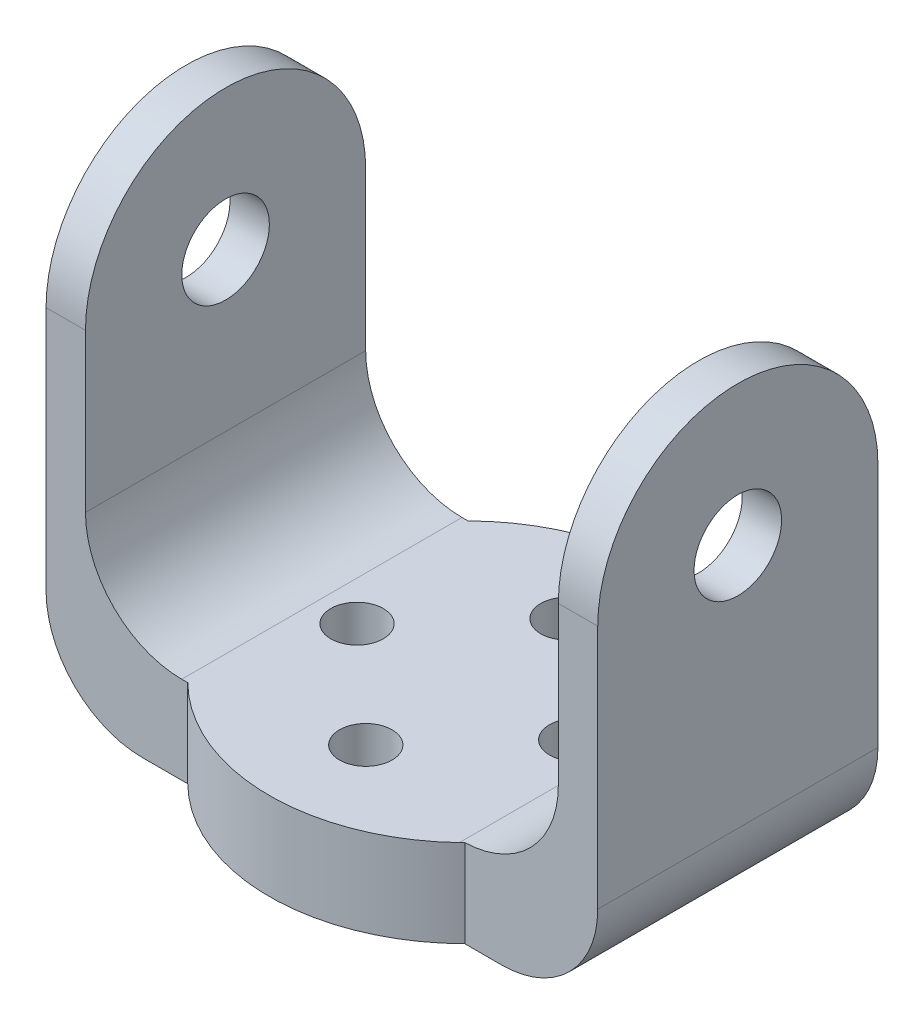
ISO-10303-21;
HEADER;
FILE_DESCRIPTION(('STEP AP214'),'2;1');
FILE_NAME('part.step','',(''),(''),'','','');
FILE_SCHEMA(('AUTOMOTIVE_DESIGN { 1 0 10303 214 1 1 1 1 }'));
ENDSEC;
DATA;
#1=APPLICATION_CONTEXT('core data for automotive mechanical design processes');
#2=APPLICATION_PROTOCOL_DEFINITION('international standard','automotive_design',2000,#1);
#3=PRODUCT_CONTEXT('',#1,'mechanical');
#4=PRODUCT('Part','Part','',(#3));
#5=PRODUCT_RELATED_PRODUCT_CATEGORY('part','',(#4));
#6=PRODUCT_DEFINITION_FORMATION('','',#4);
#7=PRODUCT_DEFINITION_CONTEXT('part definition',#1,'design');
#8=PRODUCT_DEFINITION('design','',#6,#7);
#9=PRODUCT_DEFINITION_SHAPE('','',#8);
#10=(LENGTH_UNIT() NAMED_UNIT(*) SI_UNIT(.MILLI.,.METRE.));
#11=(NAMED_UNIT(*) PLANE_ANGLE_UNIT() SI_UNIT($,.RADIAN.));
#12=(NAMED_UNIT(*) SI_UNIT($,.STERADIAN.) SOLID_ANGLE_UNIT());
#13=UNCERTAINTY_MEASURE_WITH_UNIT(LENGTH_MEASURE(1.E-05),#10,'distance_accuracy_value','');
#14=(GEOMETRIC_REPRESENTATION_CONTEXT(3) GLOBAL_UNCERTAINTY_ASSIGNED_CONTEXT((#13)) GLOBAL_UNIT_ASSIGNED_CONTEXT((#10,
#11,#12)) REPRESENTATION_CONTEXT('',''));
#15=CARTESIAN_POINT('',(0.,0.,0.));
#16=DIRECTION('',(0.,0.,1.));
#17=DIRECTION('',(1.,0.,0.));
#18=AXIS2_PLACEMENT_3D('',#15,#16,#17);
#19=CARTESIAN_POINT('',(-14.6129032258065,12.1854838709677,16.));
#20=DIRECTION('',(-1.,0.,0.));
#21=DIRECTION('',(0.,0.,1.));
#22=AXIS2_PLACEMENT_3D('',#19,#20,#21);
#23=CYLINDRICAL_SURFACE('',#22,16.);
#24=DIRECTION('',(1.,0.,0.));
#25=VECTOR('',#24,1.);
#26=CARTESIAN_POINT('',(-14.6129032258065,12.1854838709677,32.));
#27=LINE('',#26,#25);
#28=CARTESIAN_POINT('',(-14.6129032258065,12.1854838709677,32.));
#29=VERTEX_POINT('',#28);
#30=CARTESIAN_POINT('',(-19.1129032258065,12.1854838709677,32.));
#31=VERTEX_POINT('',#30);
#32=EDGE_CURVE('E354',#29,#31,#27,.F.);
#33=ORIENTED_EDGE('',*,*,#32,.F.);
#34=CARTESIAN_POINT('',(-14.6129032258065,12.1854838709677,16.));
#35=DIRECTION('',(-1.,0.,0.));
#36=DIRECTION('',(0.,-1.,0.));
#37=AXIS2_PLACEMENT_3D('',#34,#35,#36);
#38=CIRCLE('',#37,16.);
#39=CARTESIAN_POINT('',(-14.6129032258065,12.1854838709677,0.));
#40=VERTEX_POINT('',#39);
#41=EDGE_CURVE('E59',#40,#29,#38,.F.);
#42=ORIENTED_EDGE('',*,*,#41,.F.);
#43=DIRECTION('',(-1.,0.,0.));
#44=VECTOR('',#43,1.);
#45=CARTESIAN_POINT('',(0.,12.1854838709677,0.));
#46=LINE('',#45,#44);
#47=CARTESIAN_POINT('',(-19.1129032258065,12.1854838709677,0.));
#48=VERTEX_POINT('',#47);
#49=EDGE_CURVE('E358',#48,#40,#46,.F.);
#50=ORIENTED_EDGE('',*,*,#49,.F.);
#51=CARTESIAN_POINT('',(-19.1129032258065,12.1854838709677,16.));
#52=DIRECTION('',(1.,0.,0.));
#53=DIRECTION('',(0.,0.,-1.));
#54=AXIS2_PLACEMENT_3D('',#51,#52,#53);
#55=CIRCLE('',#54,16.);
#56=EDGE_CURVE('E11',#31,#48,#55,.F.);
#57=ORIENTED_EDGE('',*,*,#56,.F.);
#58=EDGE_LOOP('',(#33,#42,#50,#57));
#59=FACE_BOUND('',#58,.T.);
#60=ADVANCED_FACE('F49',(#59),#23,.T.);
#61=CARTESIAN_POINT('',(43.8870967741935,12.1854838709677,16.));
#62=DIRECTION('',(-1.,0.,0.));
#63=DIRECTION('',(0.,0.,1.));
#64=AXIS2_PLACEMENT_3D('',#61,#62,#63);
#65=CYLINDRICAL_SURFACE('',#64,16.);
#66=DIRECTION('',(1.,0.,0.));
#67=VECTOR('',#66,1.);
#68=CARTESIAN_POINT('',(43.8870967741935,12.1854838709677,32.));
#69=LINE('',#68,#67);
#70=CARTESIAN_POINT('',(43.8870967741935,12.1854838709677,32.));
#71=VERTEX_POINT('',#70);
#72=CARTESIAN_POINT('',(39.3870967741935,12.1854838709678,32.));
#73=VERTEX_POINT('',#72);
#74=EDGE_CURVE('E340',#71,#73,#69,.F.);
#75=ORIENTED_EDGE('',*,*,#74,.F.);
#76=CARTESIAN_POINT('',(43.8870967741935,12.1854838709677,16.));
#77=DIRECTION('',(-1.,0.,0.));
#78=DIRECTION('',(0.,0.,1.));
#79=AXIS2_PLACEMENT_3D('',#76,#77,#78);
#80=CIRCLE('',#79,16.);
#81=CARTESIAN_POINT('',(43.8870967741935,12.1854838709677,0.));
#82=VERTEX_POINT('',#81);
#83=EDGE_CURVE('E348',#82,#71,#80,.F.);
#84=ORIENTED_EDGE('',*,*,#83,.F.);
#85=DIRECTION('',(-1.,0.,0.));
#86=VECTOR('',#85,1.);
#87=CARTESIAN_POINT('',(0.,12.1854838709677,0.));
#88=LINE('',#87,#86);
#89=CARTESIAN_POINT('',(39.3870967741935,12.1854838709678,0.));
#90=VERTEX_POINT('',#89);
#91=EDGE_CURVE('E344',#90,#82,#88,.F.);
#92=ORIENTED_EDGE('',*,*,#91,.F.);
#93=CARTESIAN_POINT('',(39.3870967741935,12.1854838709677,16.));
#94=DIRECTION('',(1.,0.,0.));
#95=DIRECTION('',(0.,1.,0.));
#96=AXIS2_PLACEMENT_3D('',#93,#94,#95);
#97=CIRCLE('',#96,16.);
#98=EDGE_CURVE('E351',#73,#90,#97,.F.);
#99=ORIENTED_EDGE('',*,*,#98,.F.);
#100=EDGE_LOOP('',(#75,#84,#92,#99));
#101=FACE_BOUND('',#100,.T.);
#102=ADVANCED_FACE('F416',(#101),#65,.T.);
#103=CARTESIAN_POINT('',(0.,0.,32.));
#104=DIRECTION('',(0.,0.,1.));
#105=DIRECTION('',(1.,0.,0.));
#106=AXIS2_PLACEMENT_3D('',#103,#104,#105);
#107=PLANE('',#106);
#108=DIRECTION('',(0.,1.,0.));
#109=VECTOR('',#108,1.);
#110=CARTESIAN_POINT('',(-14.6129032258065,-16.8145161290323,32.));
#111=LINE('',#110,#109);
#112=CARTESIAN_POINT('',(-14.6129032258065,-5.81451612903227,32.));
#113=VERTEX_POINT('',#112);
#114=EDGE_CURVE('E221',#113,#29,#111,.T.);
#115=ORIENTED_EDGE('',*,*,#114,.T.);
#116=ORIENTED_EDGE('',*,*,#32,.T.);
#117=DIRECTION('',(0.,-1.,0.));
#118=VECTOR('',#117,1.);
#119=CARTESIAN_POINT('',(-19.1129032258065,28.1854838709677,32.));
#120=LINE('',#119,#118);
#121=CARTESIAN_POINT('',(-19.1129032258065,-15.8145161290323,32.));
#122=VERTEX_POINT('',#121);
#123=EDGE_CURVE('E175',#31,#122,#120,.T.);
#124=ORIENTED_EDGE('',*,*,#123,.T.);
#125=CARTESIAN_POINT('',(-8.11290322580646,-15.8145161290323,32.));
#126=DIRECTION('',(0.,0.,1.));
#127=DIRECTION('',(1.,0.,0.));
#128=AXIS2_PLACEMENT_3D('',#125,#126,#127);
#129=CIRCLE('',#128,11.);
#130=CARTESIAN_POINT('',(-8.11290322580646,-26.8145161290323,32.));
#131=VERTEX_POINT('',#130);
#132=EDGE_CURVE('E282',#122,#131,#129,.T.);
#133=ORIENTED_EDGE('',*,*,#132,.T.);
#134=DIRECTION('',(1.,0.,0.));
#135=VECTOR('',#134,1.);
#136=CARTESIAN_POINT('',(-19.1129032258065,-26.8145161290323,32.));
#137=LINE('',#136,#135);
#138=CARTESIAN_POINT('',(-2.93219524536285,-26.8145161290323,32.));
#139=VERTEX_POINT('',#138);
#140=EDGE_CURVE('E174',#131,#139,#137,.T.);
#141=ORIENTED_EDGE('',*,*,#140,.T.);
#142=DIRECTION('',(0.,-1.,0.));
#143=VECTOR('',#142,1.);
#144=CARTESIAN_POINT('',(-2.93219524536285,-16.8145161290323,32.));
#145=LINE('',#144,#143);
#146=CARTESIAN_POINT('',(-2.93219524536285,-16.8145161290323,32.));
#147=VERTEX_POINT('',#146);
#148=EDGE_CURVE('E186',#147,#139,#145,.T.);
#149=ORIENTED_EDGE('',*,*,#148,.F.);
#150=DIRECTION('',(-1.,0.,0.));
#151=VECTOR('',#150,1.);
#152=CARTESIAN_POINT('',(39.3870967741935,-16.8145161290322,32.));
#153=LINE('',#152,#151);
#154=CARTESIAN_POINT('',(-3.61290322580646,-16.8145161290323,32.));
#155=VERTEX_POINT('',#154);
#156=EDGE_CURVE('E217',#147,#155,#153,.T.);
#157=ORIENTED_EDGE('',*,*,#156,.T.);
#158=CARTESIAN_POINT('',(-3.61290322580646,-5.81451612903226,32.));
#159=DIRECTION('',(0.,0.,1.));
#160=DIRECTION('',(1.,0.,0.));
#161=AXIS2_PLACEMENT_3D('',#158,#159,#160);
#162=CIRCLE('',#161,11.);
#163=EDGE_CURVE('E337',#155,#113,#162,.F.);
#164=ORIENTED_EDGE('',*,*,#163,.T.);
#165=EDGE_LOOP('',(#115,#116,#124,#133,#141,#149,#157,#164));
#166=FACE_BOUND('',#165,.T.);
#167=ADVANCED_FACE('F421',(#166),#107,.T.);
#168=CARTESIAN_POINT('',(0.,0.,0.));
#169=DIRECTION('',(0.,0.,1.));
#170=DIRECTION('',(1.,0.,0.));
#171=AXIS2_PLACEMENT_3D('',#168,#169,#170);
#172=PLANE('',#171);
#173=DIRECTION('',(0.,-1.,0.));
#174=VECTOR('',#173,1.);
#175=CARTESIAN_POINT('',(-19.1129032258065,28.1854838709677,0.));
#176=LINE('',#175,#174);
#177=CARTESIAN_POINT('',(-19.1129032258065,-15.8145161290323,0.));
#178=VERTEX_POINT('',#177);
#179=EDGE_CURVE('E206',#48,#178,#176,.T.);
#180=ORIENTED_EDGE('',*,*,#179,.F.);
#181=ORIENTED_EDGE('',*,*,#49,.T.);
#182=DIRECTION('',(0.,1.,0.));
#183=VECTOR('',#182,1.);
#184=CARTESIAN_POINT('',(-14.6129032258065,-16.8145161290323,0.));
#185=LINE('',#184,#183);
#186=CARTESIAN_POINT('',(-14.6129032258065,-5.81451612903227,0.));
#187=VERTEX_POINT('',#186);
#188=EDGE_CURVE('E208',#187,#40,#185,.T.);
#189=ORIENTED_EDGE('',*,*,#188,.F.);
#190=CARTESIAN_POINT('',(-3.61290322580646,-5.81451612903226,0.));
#191=DIRECTION('',(0.,0.,1.));
#192=DIRECTION('',(1.,0.,0.));
#193=AXIS2_PLACEMENT_3D('',#190,#191,#192);
#194=CIRCLE('',#193,11.);
#195=CARTESIAN_POINT('',(-3.61290322580646,-16.8145161290323,0.));
#196=VERTEX_POINT('',#195);
#197=EDGE_CURVE('E334',#187,#196,#194,.T.);
#198=ORIENTED_EDGE('',*,*,#197,.T.);
#199=DIRECTION('',(-1.,0.,0.));
#200=VECTOR('',#199,1.);
#201=CARTESIAN_POINT('',(39.3870967741935,-16.8145161290322,0.));
#202=LINE('',#201,#200);
#203=CARTESIAN_POINT('',(-2.93219524536285,-16.8145161290323,0.));
#204=VERTEX_POINT('',#203);
#205=EDGE_CURVE('E239',#204,#196,#202,.T.);
#206=ORIENTED_EDGE('',*,*,#205,.F.);
#207=DIRECTION('',(0.,-1.,0.));
#208=VECTOR('',#207,1.);
#209=CARTESIAN_POINT('',(-2.93219524536285,-16.8145161290323,0.));
#210=LINE('',#209,#208);
#211=CARTESIAN_POINT('',(-2.93219524536284,-26.8145161290323,0.));
#212=VERTEX_POINT('',#211);
#213=EDGE_CURVE('E248',#204,#212,#210,.T.);
#214=ORIENTED_EDGE('',*,*,#213,.T.);
#215=DIRECTION('',(1.,0.,0.));
#216=VECTOR('',#215,1.);
#217=CARTESIAN_POINT('',(-19.1129032258065,-26.8145161290323,0.));
#218=LINE('',#217,#216);
#219=CARTESIAN_POINT('',(-8.11290322580646,-26.8145161290323,0.));
#220=VERTEX_POINT('',#219);
#221=EDGE_CURVE('E229',#220,#212,#218,.T.);
#222=ORIENTED_EDGE('',*,*,#221,.F.);
#223=CARTESIAN_POINT('',(-8.11290322580646,-15.8145161290323,0.));
#224=DIRECTION('',(0.,0.,1.));
#225=DIRECTION('',(1.,0.,0.));
#226=AXIS2_PLACEMENT_3D('',#223,#224,#225);
#227=CIRCLE('',#226,11.);
#228=EDGE_CURVE('E274',#220,#178,#227,.F.);
#229=ORIENTED_EDGE('',*,*,#228,.T.);
#230=EDGE_LOOP('',(#180,#181,#189,#198,#206,#214,#222,#229));
#231=FACE_BOUND('',#230,.T.);
#232=ADVANCED_FACE('F436',(#231),#172,.F.);
#233=CARTESIAN_POINT('',(-19.1129032258065,28.1854838709677,32.));
#234=DIRECTION('',(1.,0.,0.));
#235=DIRECTION('',(0.,0.,-1.));
#236=AXIS2_PLACEMENT_3D('',#233,#234,#235);
#237=PLANE('',#236);
#238=CARTESIAN_POINT('',(-19.1129032258065,12.1854838709677,16.));
#239=DIRECTION('',(1.,0.,0.));
#240=DIRECTION('',(0.,1.,0.));
#241=AXIS2_PLACEMENT_3D('',#238,#239,#240);
#242=CIRCLE('',#241,5.);
#243=CARTESIAN_POINT('',(-19.1129032258065,17.1854838709677,16.));
#244=VERTEX_POINT('',#243);
#245=EDGE_CURVE('E258',#244,#244,#242,.T.);
#246=ORIENTED_EDGE('',*,*,#245,.T.);
#247=EDGE_LOOP('',(#246));
#248=FACE_BOUND('',#247,.T.);
#249=ORIENTED_EDGE('',*,*,#123,.F.);
#250=ORIENTED_EDGE('',*,*,#56,.T.);
#251=ORIENTED_EDGE('',*,*,#179,.T.);
#252=DIRECTION('',(0.,0.,-1.));
#253=VECTOR('',#252,1.);
#254=CARTESIAN_POINT('',(-19.1129032258065,-15.8145161290323,32.));
#255=LINE('',#254,#253);
#256=EDGE_CURVE('E278',#178,#122,#255,.F.);
#257=ORIENTED_EDGE('',*,*,#256,.T.);
#258=EDGE_LOOP('',(#249,#250,#251,#257));
#259=FACE_BOUND('',#258,.T.);
#260=ADVANCED_FACE('F452',(#248,#259),#237,.F.);
#261=CARTESIAN_POINT('',(-19.1129032258065,-26.8145161290323,32.));
#262=DIRECTION('',(0.,1.,0.));
#263=DIRECTION('',(-1.,0.,0.));
#264=AXIS2_PLACEMENT_3D('',#261,#262,#263);
#265=PLANE('',#264);
#266=CARTESIAN_POINT('',(12.3870967741935,-26.8145161290323,4.0104211917182));
#267=DIRECTION('',(0.,1.,0.));
#268=DIRECTION('',(-1.,0.,0.));
#269=AXIS2_PLACEMENT_3D('',#266,#267,#268);
#270=CIRCLE('',#269,3.);
#271=CARTESIAN_POINT('',(9.38709677419355,-26.8145161290323,4.0104211917182));
#272=VERTEX_POINT('',#271);
#273=EDGE_CURVE('E368',#272,#272,#270,.T.);
#274=ORIENTED_EDGE('',*,*,#273,.T.);
#275=EDGE_LOOP('',(#274));
#276=FACE_BOUND('',#275,.T.);
#277=CARTESIAN_POINT('',(24.8766755824753,-26.8145161290323,15.5));
#278=DIRECTION('',(0.,1.,0.));
#279=DIRECTION('',(-1.,0.,0.));
#280=AXIS2_PLACEMENT_3D('',#277,#278,#279);
#281=CIRCLE('',#280,2.99999999999999);
#282=CARTESIAN_POINT('',(21.8766755824753,-26.8145161290323,15.5));
#283=VERTEX_POINT('',#282);
#284=EDGE_CURVE('E586',#283,#283,#281,.T.);
#285=ORIENTED_EDGE('',*,*,#284,.T.);
#286=EDGE_LOOP('',(#285));
#287=FACE_BOUND('',#286,.T.);
#288=CARTESIAN_POINT('',(13.3870967741935,-26.8145161290323,27.9895788082818));
#289=DIRECTION('',(0.,1.,0.));
#290=DIRECTION('',(-1.,0.,0.));
#291=AXIS2_PLACEMENT_3D('',#288,#289,#290);
#292=CIRCLE('',#291,3.);
#293=CARTESIAN_POINT('',(10.3870967741935,-26.8145161290323,27.9895788082818));
#294=VERTEX_POINT('',#293);
#295=EDGE_CURVE('E591',#294,#294,#292,.T.);
#296=ORIENTED_EDGE('',*,*,#295,.T.);
#297=EDGE_LOOP('',(#296));
#298=FACE_BOUND('',#297,.T.);
#299=CARTESIAN_POINT('',(0.897517965911735,-26.8145161290323,16.5));
#300=DIRECTION('',(0.,1.,0.));
#301=DIRECTION('',(-1.,0.,0.));
#302=AXIS2_PLACEMENT_3D('',#299,#300,#301);
#303=CIRCLE('',#302,3.);
#304=CARTESIAN_POINT('',(-2.10248203408827,-26.8145161290323,16.5));
#305=VERTEX_POINT('',#304);
#306=EDGE_CURVE('E390',#305,#305,#303,.T.);
#307=ORIENTED_EDGE('',*,*,#306,.T.);
#308=EDGE_LOOP('',(#307));
#309=FACE_BOUND('',#308,.T.);
#310=CARTESIAN_POINT('',(28.7063887937499,-26.8145161290323,0.));
#311=VERTEX_POINT('',#310);
#312=CARTESIAN_POINT('',(32.8870967741935,-26.8145161290323,0.));
#313=VERTEX_POINT('',#312);
#314=EDGE_CURVE('E228',#311,#313,#218,.T.);
#315=ORIENTED_EDGE('',*,*,#314,.T.);
#316=DIRECTION('',(0.,0.,-1.));
#317=VECTOR('',#316,1.);
#318=CARTESIAN_POINT('',(32.8870967741935,-26.8145161290323,32.));
#319=LINE('',#318,#317);
#320=CARTESIAN_POINT('',(32.8870967741935,-26.8145161290323,32.));
#321=VERTEX_POINT('',#320);
#322=EDGE_CURVE('E170',#313,#321,#319,.F.);
#323=ORIENTED_EDGE('',*,*,#322,.T.);
#324=CARTESIAN_POINT('',(28.7063887937499,-26.8145161290322,32.));
#325=VERTEX_POINT('',#324);
#326=EDGE_CURVE('E162',#325,#321,#137,.T.);
#327=ORIENTED_EDGE('',*,*,#326,.F.);
#328=CARTESIAN_POINT('',(12.8870967741935,-26.8145161290323,16.));
#329=DIRECTION('',(0.,-1.,0.));
#330=DIRECTION('',(1.,0.,0.));
#331=AXIS2_PLACEMENT_3D('',#328,#329,#330);
#332=CIRCLE('',#331,22.5);
#333=EDGE_CURVE('E168',#325,#139,#332,.T.);
#334=ORIENTED_EDGE('',*,*,#333,.T.);
#335=ORIENTED_EDGE('',*,*,#140,.F.);
#336=DIRECTION('',(0.,0.,-1.));
#337=VECTOR('',#336,1.);
#338=CARTESIAN_POINT('',(-8.11290322580646,-26.8145161290323,32.));
#339=LINE('',#338,#337);
#340=EDGE_CURVE('E265',#131,#220,#339,.T.);
#341=ORIENTED_EDGE('',*,*,#340,.T.);
#342=ORIENTED_EDGE('',*,*,#221,.T.);
#343=EDGE_CURVE('E194',#212,#311,#332,.T.);
#344=ORIENTED_EDGE('',*,*,#343,.T.);
#345=EDGE_LOOP('',(#315,#323,#327,#334,#335,#341,#342,#344));
#346=FACE_BOUND('',#345,.T.);
#347=ADVANCED_FACE('F165',(#276,#287,#298,#309,#346),#265,.F.);
#348=CARTESIAN_POINT('',(43.8870967741935,-26.8145161290322,32.));
#349=DIRECTION('',(-1.,0.,0.));
#350=DIRECTION('',(0.,0.,1.));
#351=AXIS2_PLACEMENT_3D('',#348,#349,#350);
#352=PLANE('',#351);
#353=CARTESIAN_POINT('',(43.8870967741935,12.1854838709677,16.));
#354=DIRECTION('',(-1.,0.,0.));
#355=DIRECTION('',(0.,0.,1.));
#356=AXIS2_PLACEMENT_3D('',#353,#354,#355);
#357=CIRCLE('',#356,5.);
#358=CARTESIAN_POINT('',(43.8870967741935,12.1854838709677,21.));
#359=VERTEX_POINT('',#358);
#360=EDGE_CURVE('E201',#359,#359,#357,.T.);
#361=ORIENTED_EDGE('',*,*,#360,.T.);
#362=EDGE_LOOP('',(#361));
#363=FACE_BOUND('',#362,.T.);
#364=DIRECTION('',(0.,1.,0.));
#365=VECTOR('',#364,1.);
#366=CARTESIAN_POINT('',(43.8870967741935,-26.8145161290322,0.));
#367=LINE('',#366,#365);
#368=CARTESIAN_POINT('',(43.8870967741935,-15.8145161290323,0.));
#369=VERTEX_POINT('',#368);
#370=EDGE_CURVE('E232',#369,#82,#367,.T.);
#371=ORIENTED_EDGE('',*,*,#370,.T.);
#372=ORIENTED_EDGE('',*,*,#83,.T.);
#373=DIRECTION('',(0.,1.,0.));
#374=VECTOR('',#373,1.);
#375=CARTESIAN_POINT('',(43.8870967741935,-26.8145161290322,32.));
#376=LINE('',#375,#374);
#377=CARTESIAN_POINT('',(43.8870967741935,-15.8145161290323,32.));
#378=VERTEX_POINT('',#377);
#379=EDGE_CURVE('E211',#378,#71,#376,.T.);
#380=ORIENTED_EDGE('',*,*,#379,.F.);
#381=DIRECTION('',(0.,0.,-1.));
#382=VECTOR('',#381,1.);
#383=CARTESIAN_POINT('',(43.8870967741935,-15.8145161290323,32.));
#384=LINE('',#383,#382);
#385=EDGE_CURVE('E252',#378,#369,#384,.T.);
#386=ORIENTED_EDGE('',*,*,#385,.T.);
#387=EDGE_LOOP('',(#371,#372,#380,#386));
#388=FACE_BOUND('',#387,.T.);
#389=ADVANCED_FACE('F399',(#363,#388),#352,.F.);
#390=CARTESIAN_POINT('',(39.3870967741935,28.1854838709678,32.));
#391=DIRECTION('',(1.,0.,0.));
#392=DIRECTION('',(0.,1.,0.));
#393=AXIS2_PLACEMENT_3D('',#390,#391,#392);
#394=PLANE('',#393);
#395=CARTESIAN_POINT('',(39.3870967741935,12.1854838709677,16.));
#396=DIRECTION('',(1.,0.,0.));
#397=DIRECTION('',(0.,1.,0.));
#398=AXIS2_PLACEMENT_3D('',#395,#396,#397);
#399=CIRCLE('',#398,5.);
#400=CARTESIAN_POINT('',(39.3870967741935,17.1854838709678,16.));
#401=VERTEX_POINT('',#400);
#402=EDGE_CURVE('E257',#401,#401,#399,.T.);
#403=ORIENTED_EDGE('',*,*,#402,.T.);
#404=EDGE_LOOP('',(#403));
#405=FACE_BOUND('',#404,.T.);
#406=DIRECTION('',(0.,-1.,0.));
#407=VECTOR('',#406,1.);
#408=CARTESIAN_POINT('',(39.3870967741935,28.1854838709678,32.));
#409=LINE('',#408,#407);
#410=CARTESIAN_POINT('',(39.3870967741935,-5.81451612903224,32.));
#411=VERTEX_POINT('',#410);
#412=EDGE_CURVE('E214',#73,#411,#409,.T.);
#413=ORIENTED_EDGE('',*,*,#412,.F.);
#414=ORIENTED_EDGE('',*,*,#98,.T.);
#415=DIRECTION('',(0.,-1.,0.));
#416=VECTOR('',#415,1.);
#417=CARTESIAN_POINT('',(39.3870967741935,28.1854838709678,0.));
#418=LINE('',#417,#416);
#419=CARTESIAN_POINT('',(39.3870967741935,-5.81451612903224,0.));
#420=VERTEX_POINT('',#419);
#421=EDGE_CURVE('E236',#90,#420,#418,.T.);
#422=ORIENTED_EDGE('',*,*,#421,.T.);
#423=DIRECTION('',(0.,0.,-1.));
#424=VECTOR('',#423,1.);
#425=CARTESIAN_POINT('',(39.3870967741935,-5.81451612903225,32.));
#426=LINE('',#425,#424);
#427=EDGE_CURVE('E292',#420,#411,#426,.F.);
#428=ORIENTED_EDGE('',*,*,#427,.T.);
#429=EDGE_LOOP('',(#413,#414,#422,#428));
#430=FACE_BOUND('',#429,.T.);
#431=ADVANCED_FACE('F514',(#405,#430),#394,.F.);
#432=CARTESIAN_POINT('',(39.3870967741935,-16.8145161290322,32.));
#433=DIRECTION('',(0.,-1.,0.));
#434=DIRECTION('',(1.,0.,0.));
#435=AXIS2_PLACEMENT_3D('',#432,#433,#434);
#436=PLANE('',#435);
#437=CARTESIAN_POINT('',(12.3870967741935,-16.8145161290323,4.0104211917182));
#438=DIRECTION('',(0.,-1.,0.));
#439=DIRECTION('',(1.,0.,0.));
#440=AXIS2_PLACEMENT_3D('',#437,#438,#439);
#441=CIRCLE('',#440,3.);
#442=CARTESIAN_POINT('',(15.3870967741935,-16.8145161290323,4.0104211917182));
#443=VERTEX_POINT('',#442);
#444=EDGE_CURVE('E53',#443,#443,#441,.T.);
#445=ORIENTED_EDGE('',*,*,#444,.T.);
#446=EDGE_LOOP('',(#445));
#447=FACE_BOUND('',#446,.T.);
#448=CARTESIAN_POINT('',(24.8766755824753,-16.8145161290323,15.5));
#449=DIRECTION('',(0.,-1.,0.));
#450=DIRECTION('',(1.,0.,0.));
#451=AXIS2_PLACEMENT_3D('',#448,#449,#450);
#452=CIRCLE('',#451,2.99999999999999);
#453=CARTESIAN_POINT('',(27.8766755824753,-16.8145161290323,15.5));
#454=VERTEX_POINT('',#453);
#455=EDGE_CURVE('E371',#454,#454,#452,.T.);
#456=ORIENTED_EDGE('',*,*,#455,.T.);
#457=EDGE_LOOP('',(#456));
#458=FACE_BOUND('',#457,.T.);
#459=CARTESIAN_POINT('',(13.3870967741935,-16.8145161290323,27.9895788082818));
#460=DIRECTION('',(0.,-1.,0.));
#461=DIRECTION('',(1.,0.,0.));
#462=AXIS2_PLACEMENT_3D('',#459,#460,#461);
#463=CIRCLE('',#462,3.);
#464=CARTESIAN_POINT('',(16.3870967741935,-16.8145161290323,27.9895788082818));
#465=VERTEX_POINT('',#464);
#466=EDGE_CURVE('E367',#465,#465,#463,.T.);
#467=ORIENTED_EDGE('',*,*,#466,.T.);
#468=EDGE_LOOP('',(#467));
#469=FACE_BOUND('',#468,.T.);
#470=CARTESIAN_POINT('',(0.897517965911731,-16.8145161290323,16.5));
#471=DIRECTION('',(0.,-1.,0.));
#472=DIRECTION('',(1.,0.,0.));
#473=AXIS2_PLACEMENT_3D('',#470,#471,#472);
#474=CIRCLE('',#473,3.);
#475=CARTESIAN_POINT('',(3.89751796591173,-16.8145161290323,16.5));
#476=VERTEX_POINT('',#475);
#477=EDGE_CURVE('E363',#476,#476,#474,.T.);
#478=ORIENTED_EDGE('',*,*,#477,.T.);
#479=EDGE_LOOP('',(#478));
#480=FACE_BOUND('',#479,.T.);
#481=CARTESIAN_POINT('',(12.8870967741935,-16.8145161290323,16.));
#482=DIRECTION('',(0.,-1.,0.));
#483=DIRECTION('',(1.,0.,0.));
#484=AXIS2_PLACEMENT_3D('',#481,#482,#483);
#485=CIRCLE('',#484,22.5);
#486=CARTESIAN_POINT('',(28.3870967741935,-16.8145161290322,32.3095064303001));
#487=VERTEX_POINT('',#486);
#488=EDGE_CURVE('E187',#487,#147,#485,.T.);
#489=ORIENTED_EDGE('',*,*,#488,.F.);
#490=DIRECTION('',(0.,0.,-1.));
#491=VECTOR('',#490,1.);
#492=CARTESIAN_POINT('',(28.3870967741935,-16.8145161290323,0.));
#493=LINE('',#492,#491);
#494=CARTESIAN_POINT('',(28.3870967741935,-16.8145161290322,-0.309506430300085));
#495=VERTEX_POINT('',#494);
#496=EDGE_CURVE('E288',#487,#495,#493,.T.);
#497=ORIENTED_EDGE('',*,*,#496,.T.);
#498=EDGE_CURVE('E193',#204,#495,#485,.T.);
#499=ORIENTED_EDGE('',*,*,#498,.F.);
#500=ORIENTED_EDGE('',*,*,#205,.T.);
#501=DIRECTION('',(0.,0.,-1.));
#502=VECTOR('',#501,1.);
#503=CARTESIAN_POINT('',(-3.61290322580646,-16.8145161290323,32.));
#504=LINE('',#503,#502);
#505=EDGE_CURVE('E285',#196,#155,#504,.F.);
#506=ORIENTED_EDGE('',*,*,#505,.T.);
#507=ORIENTED_EDGE('',*,*,#156,.F.);
#508=EDGE_LOOP('',(#489,#497,#499,#500,#506,#507));
#509=FACE_BOUND('',#508,.T.);
#510=ADVANCED_FACE('F440',(#447,#458,#469,#480,#509),#436,.F.);
#511=CARTESIAN_POINT('',(-14.6129032258065,-16.8145161290323,32.));
#512=DIRECTION('',(-1.,0.,0.));
#513=DIRECTION('',(0.,-1.,0.));
#514=AXIS2_PLACEMENT_3D('',#511,#512,#513);
#515=PLANE('',#514);
#516=CARTESIAN_POINT('',(-14.6129032258065,12.1854838709677,16.));
#517=DIRECTION('',(-1.,0.,0.));
#518=DIRECTION('',(0.,-1.,0.));
#519=AXIS2_PLACEMENT_3D('',#516,#517,#518);
#520=CIRCLE('',#519,5.);
#521=CARTESIAN_POINT('',(-14.6129032258065,7.18548387096774,16.));
#522=VERTEX_POINT('',#521);
#523=EDGE_CURVE('E253',#522,#522,#520,.T.);
#524=ORIENTED_EDGE('',*,*,#523,.T.);
#525=EDGE_LOOP('',(#524));
#526=FACE_BOUND('',#525,.T.);
#527=ORIENTED_EDGE('',*,*,#188,.T.);
#528=ORIENTED_EDGE('',*,*,#41,.T.);
#529=ORIENTED_EDGE('',*,*,#114,.F.);
#530=DIRECTION('',(0.,0.,-1.));
#531=VECTOR('',#530,1.);
#532=CARTESIAN_POINT('',(-14.6129032258065,-5.81451612903226,0.));
#533=LINE('',#532,#531);
#534=EDGE_CURVE('E296',#113,#187,#533,.T.);
#535=ORIENTED_EDGE('',*,*,#534,.T.);
#536=EDGE_LOOP('',(#527,#528,#529,#535));
#537=FACE_BOUND('',#536,.T.);
#538=ADVANCED_FACE('F428',(#526,#537),#515,.F.);
#539=ORIENTED_EDGE('',*,*,#379,.T.);
#540=ORIENTED_EDGE('',*,*,#74,.T.);
#541=ORIENTED_EDGE('',*,*,#412,.T.);
#542=CARTESIAN_POINT('',(28.3870967741935,-5.81451612903225,32.));
#543=DIRECTION('',(0.,0.,1.));
#544=DIRECTION('',(1.,0.,0.));
#545=AXIS2_PLACEMENT_3D('',#542,#543,#544);
#546=CIRCLE('',#545,11.);
#547=CARTESIAN_POINT('',(28.7063887937499,-16.8098811801003,32.));
#548=VERTEX_POINT('',#547);
#549=EDGE_CURVE('E182',#411,#548,#546,.F.);
#550=ORIENTED_EDGE('',*,*,#549,.T.);
#551=DIRECTION('',(0.,-1.,0.));
#552=VECTOR('',#551,1.);
#553=CARTESIAN_POINT('',(28.7063887937499,-16.8145161290322,32.));
#554=LINE('',#553,#552);
#555=EDGE_CURVE('E178',#325,#548,#554,.F.);
#556=ORIENTED_EDGE('',*,*,#555,.F.);
#557=ORIENTED_EDGE('',*,*,#326,.T.);
#558=CARTESIAN_POINT('',(32.8870967741935,-15.8145161290323,32.));
#559=DIRECTION('',(0.,0.,1.));
#560=DIRECTION('',(1.,0.,0.));
#561=AXIS2_PLACEMENT_3D('',#558,#559,#560);
#562=CIRCLE('',#561,11.);
#563=EDGE_CURVE('E271',#321,#378,#562,.T.);
#564=ORIENTED_EDGE('',*,*,#563,.T.);
#565=EDGE_LOOP('',(#539,#540,#541,#550,#556,#557,#564));
#566=FACE_BOUND('',#565,.T.);
#567=ADVANCED_FACE('F180',(#566),#107,.T.);
#568=ORIENTED_EDGE('',*,*,#421,.F.);
#569=ORIENTED_EDGE('',*,*,#91,.T.);
#570=ORIENTED_EDGE('',*,*,#370,.F.);
#571=CARTESIAN_POINT('',(32.8870967741935,-15.8145161290323,0.));
#572=DIRECTION('',(0.,0.,1.));
#573=DIRECTION('',(1.,0.,0.));
#574=AXIS2_PLACEMENT_3D('',#571,#572,#573);
#575=CIRCLE('',#574,11.);
#576=EDGE_CURVE('E262',#369,#313,#575,.F.);
#577=ORIENTED_EDGE('',*,*,#576,.T.);
#578=ORIENTED_EDGE('',*,*,#314,.F.);
#579=DIRECTION('',(0.,-1.,0.));
#580=VECTOR('',#579,1.);
#581=CARTESIAN_POINT('',(28.7063887937499,-16.8145161290322,0.));
#582=LINE('',#581,#580);
#583=CARTESIAN_POINT('',(28.7063887937499,-16.8098811801003,0.));
#584=VERTEX_POINT('',#583);
#585=EDGE_CURVE('E225',#311,#584,#582,.F.);
#586=ORIENTED_EDGE('',*,*,#585,.T.);
#587=CARTESIAN_POINT('',(28.3870967741935,-5.81451612903225,0.));
#588=DIRECTION('',(0.,0.,1.));
#589=DIRECTION('',(1.,0.,0.));
#590=AXIS2_PLACEMENT_3D('',#587,#588,#589);
#591=CIRCLE('',#590,11.);
#592=EDGE_CURVE('E310',#584,#420,#591,.T.);
#593=ORIENTED_EDGE('',*,*,#592,.T.);
#594=EDGE_LOOP('',(#568,#569,#570,#577,#578,#586,#593));
#595=FACE_BOUND('',#594,.T.);
#596=ADVANCED_FACE('F515',(#595),#172,.F.);
#597=CARTESIAN_POINT('',(12.8870967741935,-16.8145161290323,16.));
#598=DIRECTION('',(0.,-1.,0.));
#599=DIRECTION('',(1.,0.,0.));
#600=AXIS2_PLACEMENT_3D('',#597,#598,#599);
#601=CYLINDRICAL_SURFACE('',#600,22.5);
#602=ORIENTED_EDGE('',*,*,#213,.F.);
#603=ORIENTED_EDGE('',*,*,#498,.T.);
#604=CARTESIAN_POINT('',(28.3870967741935,-16.8145161290323,-0.309506430300081));
#605=CARTESIAN_POINT('',(28.4408275966832,-16.8145087508069,-0.258442351345416));
#606=CARTESIAN_POINT('',(28.4943006762242,-16.8141188159499,-0.207118109343227));
#607=CARTESIAN_POINT('',(28.6007313494097,-16.8125738329725,-0.103949299243206));
#608=CARTESIAN_POINT('',(28.6536889430541,-16.8114187848522,-0.0521047311453674));
#609=CARTESIAN_POINT('',(28.7063887937499,-16.8098811801003,0.));
#610=B_SPLINE_CURVE_WITH_KNOTS('',3,(#604,#605,#606,#607,#608,#609),.UNSPECIFIED.,.F.,.F.,(4,2,
4),(0.,0.222358496390487,0.444716992783542),.UNSPECIFIED.);
#611=EDGE_CURVE('E300',#495,#584,#610,.T.);
#612=ORIENTED_EDGE('',*,*,#611,.T.);
#613=ORIENTED_EDGE('',*,*,#585,.F.);
#614=ORIENTED_EDGE('',*,*,#343,.F.);
#615=EDGE_LOOP('',(#602,#603,#612,#613,#614));
#616=FACE_BOUND('',#615,.T.);
#617=ADVANCED_FACE('F321',(#616),#601,.T.);
#618=ORIENTED_EDGE('',*,*,#555,.T.);
#619=CARTESIAN_POINT('',(28.7063887937499,-16.8098811801003,32.));
#620=CARTESIAN_POINT('',(28.6536889430541,-16.8114187848522,32.0521047311454));
#621=CARTESIAN_POINT('',(28.6007313494097,-16.8125738329725,32.1039492992432));
#622=CARTESIAN_POINT('',(28.4943006762242,-16.8141188159499,32.2071181093432));
#623=CARTESIAN_POINT('',(28.4408275966832,-16.8145087508069,32.2584423513454));
#624=CARTESIAN_POINT('',(28.3870967741935,-16.8145161290323,32.3095064303001));
#625=B_SPLINE_CURVE_WITH_KNOTS('',3,(#619,#620,#621,#622,#623,#624),.UNSPECIFIED.,.F.,.F.,(4,2,
4),(0.,0.22235849639306,0.444716992783541),.UNSPECIFIED.);
#626=EDGE_CURVE('E327',#548,#487,#625,.T.);
#627=ORIENTED_EDGE('',*,*,#626,.T.);
#628=ORIENTED_EDGE('',*,*,#488,.T.);
#629=ORIENTED_EDGE('',*,*,#148,.T.);
#630=ORIENTED_EDGE('',*,*,#333,.F.);
#631=EDGE_LOOP('',(#618,#627,#628,#629,#630));
#632=FACE_BOUND('',#631,.T.);
#633=ADVANCED_FACE('F190',(#632),#601,.T.);
#634=CARTESIAN_POINT('',(-19.1129032258065,12.1854838709677,16.));
#635=DIRECTION('',(1.,0.,0.));
#636=DIRECTION('',(0.,1.,0.));
#637=AXIS2_PLACEMENT_3D('',#634,#635,#636);
#638=CYLINDRICAL_SURFACE('',#637,5.);
#639=ORIENTED_EDGE('',*,*,#245,.F.);
#640=EDGE_LOOP('',(#639));
#641=FACE_BOUND('',#640,.T.);
#642=ORIENTED_EDGE('',*,*,#523,.F.);
#643=EDGE_LOOP('',(#642));
#644=FACE_BOUND('',#643,.T.);
#645=ADVANCED_FACE('F320',(#641,#644),#638,.F.);
#646=ORIENTED_EDGE('',*,*,#402,.F.);
#647=EDGE_LOOP('',(#646));
#648=FACE_BOUND('',#647,.T.);
#649=ORIENTED_EDGE('',*,*,#360,.F.);
#650=EDGE_LOOP('',(#649));
#651=FACE_BOUND('',#650,.T.);
#652=ADVANCED_FACE('F322',(#648,#651),#638,.F.);
#653=CARTESIAN_POINT('',(32.8870967741935,-15.8145161290323,32.));
#654=DIRECTION('',(0.,0.,-1.));
#655=DIRECTION('',(-1.,0.,0.));
#656=AXIS2_PLACEMENT_3D('',#653,#654,#655);
#657=CYLINDRICAL_SURFACE('',#656,11.);
#658=ORIENTED_EDGE('',*,*,#563,.F.);
#659=ORIENTED_EDGE('',*,*,#322,.F.);
#660=ORIENTED_EDGE('',*,*,#576,.F.);
#661=ORIENTED_EDGE('',*,*,#385,.F.);
#662=EDGE_LOOP('',(#658,#659,#660,#661));
#663=FACE_BOUND('',#662,.T.);
#664=ADVANCED_FACE('F403',(#663),#657,.T.);
#665=CARTESIAN_POINT('',(-8.11290322580646,-15.8145161290323,32.));
#666=DIRECTION('',(0.,0.,-1.));
#667=DIRECTION('',(-1.,0.,0.));
#668=AXIS2_PLACEMENT_3D('',#665,#666,#667);
#669=CYLINDRICAL_SURFACE('',#668,11.);
#670=ORIENTED_EDGE('',*,*,#132,.F.);
#671=ORIENTED_EDGE('',*,*,#256,.F.);
#672=ORIENTED_EDGE('',*,*,#228,.F.);
#673=ORIENTED_EDGE('',*,*,#340,.F.);
#674=EDGE_LOOP('',(#670,#671,#672,#673));
#675=FACE_BOUND('',#674,.T.);
#676=ADVANCED_FACE('F410',(#675),#669,.T.);
#677=CARTESIAN_POINT('',(28.3870967741935,-5.81451612903225,32.));
#678=DIRECTION('',(0.,0.,1.));
#679=DIRECTION('',(1.,0.,0.));
#680=AXIS2_PLACEMENT_3D('',#677,#678,#679);
#681=CYLINDRICAL_SURFACE('',#680,11.);
#682=ORIENTED_EDGE('',*,*,#549,.F.);
#683=ORIENTED_EDGE('',*,*,#427,.F.);
#684=ORIENTED_EDGE('',*,*,#592,.F.);
#685=ORIENTED_EDGE('',*,*,#611,.F.);
#686=ORIENTED_EDGE('',*,*,#496,.F.);
#687=ORIENTED_EDGE('',*,*,#626,.F.);
#688=EDGE_LOOP('',(#682,#683,#684,#685,#686,#687));
#689=FACE_BOUND('',#688,.T.);
#690=ADVANCED_FACE('F312',(#689),#681,.F.);
#691=CARTESIAN_POINT('',(-3.61290322580646,-5.81451612903226,32.));
#692=DIRECTION('',(0.,0.,1.));
#693=DIRECTION('',(1.,0.,0.));
#694=AXIS2_PLACEMENT_3D('',#691,#692,#693);
#695=CYLINDRICAL_SURFACE('',#694,11.);
#696=ORIENTED_EDGE('',*,*,#163,.F.);
#697=ORIENTED_EDGE('',*,*,#505,.F.);
#698=ORIENTED_EDGE('',*,*,#197,.F.);
#699=ORIENTED_EDGE('',*,*,#534,.F.);
#700=EDGE_LOOP('',(#696,#697,#698,#699));
#701=FACE_BOUND('',#700,.T.);
#702=ADVANCED_FACE('F431',(#701),#695,.F.);
#703=CARTESIAN_POINT('',(0.897517965911735,-26.8145161290323,16.5));
#704=DIRECTION('',(0.,1.,0.));
#705=DIRECTION('',(-1.,0.,0.));
#706=AXIS2_PLACEMENT_3D('',#703,#704,#705);
#707=CYLINDRICAL_SURFACE('',#706,3.);
#708=ORIENTED_EDGE('',*,*,#306,.F.);
#709=EDGE_LOOP('',(#708));
#710=FACE_BOUND('',#709,.T.);
#711=ORIENTED_EDGE('',*,*,#477,.F.);
#712=EDGE_LOOP('',(#711));
#713=FACE_BOUND('',#712,.T.);
#714=ADVANCED_FACE('F542',(#710,#713),#707,.F.);
#715=CARTESIAN_POINT('',(13.3870967741935,-26.8145161290323,27.9895788082818));
#716=DIRECTION('',(0.,1.,0.));
#717=DIRECTION('',(-1.,0.,0.));
#718=AXIS2_PLACEMENT_3D('',#715,#716,#717);
#719=CYLINDRICAL_SURFACE('',#718,3.);
#720=ORIENTED_EDGE('',*,*,#295,.F.);
#721=EDGE_LOOP('',(#720));
#722=FACE_BOUND('',#721,.T.);
#723=ORIENTED_EDGE('',*,*,#466,.F.);
#724=EDGE_LOOP('',(#723));
#725=FACE_BOUND('',#724,.T.);
#726=ADVANCED_FACE('F548',(#722,#725),#719,.F.);
#727=CARTESIAN_POINT('',(24.8766755824753,-26.8145161290323,15.5));
#728=DIRECTION('',(0.,1.,0.));
#729=DIRECTION('',(-1.,0.,0.));
#730=AXIS2_PLACEMENT_3D('',#727,#728,#729);
#731=CYLINDRICAL_SURFACE('',#730,2.99999999999999);
#732=ORIENTED_EDGE('',*,*,#284,.F.);
#733=EDGE_LOOP('',(#732));
#734=FACE_BOUND('',#733,.T.);
#735=ORIENTED_EDGE('',*,*,#455,.F.);
#736=EDGE_LOOP('',(#735));
#737=FACE_BOUND('',#736,.T.);
#738=ADVANCED_FACE('F559',(#734,#737),#731,.F.);
#739=CARTESIAN_POINT('',(12.3870967741935,-26.8145161290323,4.0104211917182));
#740=DIRECTION('',(0.,1.,0.));
#741=DIRECTION('',(-1.,0.,0.));
#742=AXIS2_PLACEMENT_3D('',#739,#740,#741);
#743=CYLINDRICAL_SURFACE('',#742,3.);
#744=ORIENTED_EDGE('',*,*,#273,.F.);
#745=EDGE_LOOP('',(#744));
#746=FACE_BOUND('',#745,.T.);
#747=ORIENTED_EDGE('',*,*,#444,.F.);
#748=EDGE_LOOP('',(#747));
#749=FACE_BOUND('',#748,.T.);
#750=ADVANCED_FACE('F569',(#746,#749),#743,.F.);
#751=CLOSED_SHELL('',(#60,#102,#167,#232,#260,#347,#389,#431,#510,#538,#567,#596,#617,#633,#645,
#652,#664,#676,#690,#702,#714,#726,#738,#750));
#752=MANIFOLD_SOLID_BREP('B2',#751);
#753=ADVANCED_BREP_SHAPE_REPRESENTATION('',(#18,#752),#14);
#754=SHAPE_DEFINITION_REPRESENTATION(#9,#753);
ENDSEC;
END-ISO-10303-21;
